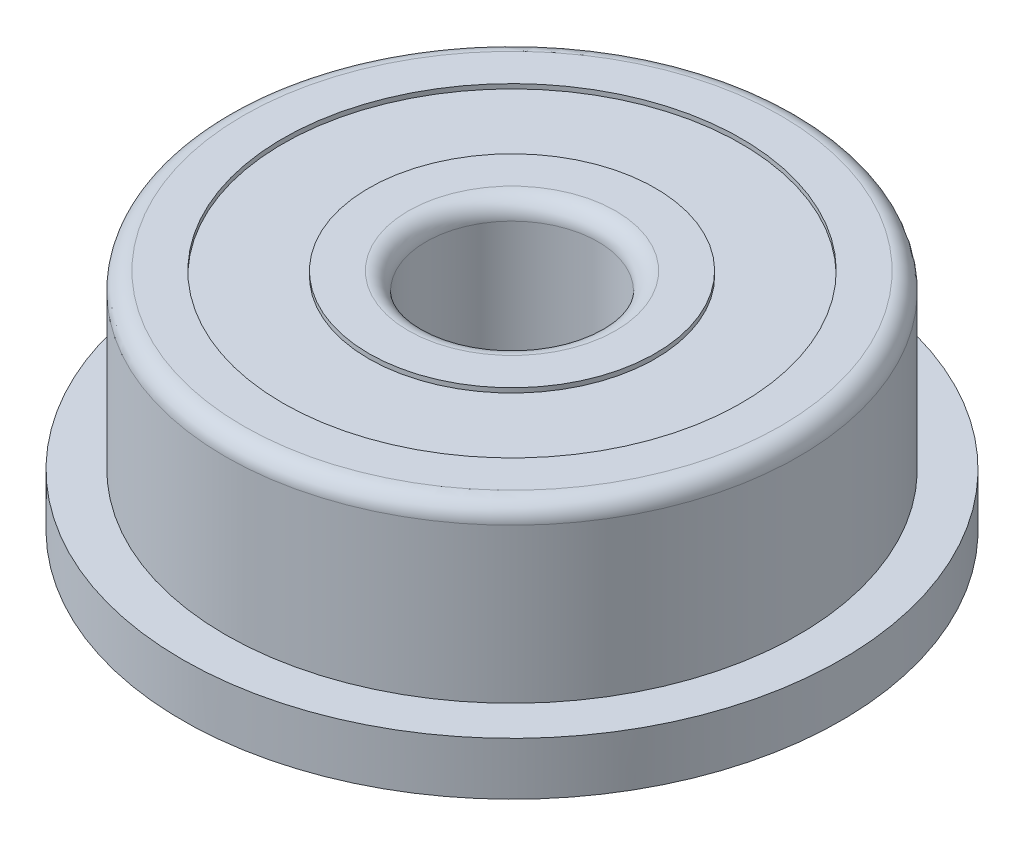
ISO-10303-21;
HEADER;
FILE_DESCRIPTION(('STEP AP214'),'2;1');
FILE_NAME('part.step','',(''),(''),'','','');
FILE_SCHEMA(('AUTOMOTIVE_DESIGN { 1 0 10303 214 1 1 1 1 }'));
ENDSEC;
DATA;
#1=APPLICATION_CONTEXT('core data for automotive mechanical design processes');
#2=APPLICATION_PROTOCOL_DEFINITION('international standard','automotive_design',2000,#1);
#3=PRODUCT_CONTEXT('',#1,'mechanical');
#4=PRODUCT('Part','Part','',(#3));
#5=PRODUCT_RELATED_PRODUCT_CATEGORY('part','',(#4));
#6=PRODUCT_DEFINITION_FORMATION('','',#4);
#7=PRODUCT_DEFINITION_CONTEXT('part definition',#1,'design');
#8=PRODUCT_DEFINITION('design','',#6,#7);
#9=PRODUCT_DEFINITION_SHAPE('','',#8);
#10=(LENGTH_UNIT() NAMED_UNIT(*) SI_UNIT(.MILLI.,.METRE.));
#11=(NAMED_UNIT(*) PLANE_ANGLE_UNIT() SI_UNIT($,.RADIAN.));
#12=(NAMED_UNIT(*) SI_UNIT($,.STERADIAN.) SOLID_ANGLE_UNIT());
#13=UNCERTAINTY_MEASURE_WITH_UNIT(LENGTH_MEASURE(1.E-05),#10,'distance_accuracy_value','');
#14=(GEOMETRIC_REPRESENTATION_CONTEXT(3) GLOBAL_UNCERTAINTY_ASSIGNED_CONTEXT((#13)) GLOBAL_UNIT_ASSIGNED_CONTEXT((#10,
#11,#12)) REPRESENTATION_CONTEXT('',''));
#15=CARTESIAN_POINT('',(0.,0.,0.));
#16=DIRECTION('',(0.,0.,1.));
#17=DIRECTION('',(1.,0.,0.));
#18=AXIS2_PLACEMENT_3D('',#15,#16,#17);
#19=CARTESIAN_POINT('',(0.,4.,0.));
#20=DIRECTION('',(0.,1.,0.));
#21=DIRECTION('',(0.,0.,1.));
#22=AXIS2_PLACEMENT_3D('',#19,#20,#21);
#23=PLANE('',#22);
#24=CARTESIAN_POINT('',(0.,4.,0.));
#25=DIRECTION('',(0.,1.,0.));
#26=DIRECTION('',(0.,0.,1.));
#27=AXIS2_PLACEMENT_3D('',#24,#25,#26);
#28=CIRCLE('',#27,1.81);
#29=CARTESIAN_POINT('',(0.,4.,1.81));
#30=VERTEX_POINT('',#29);
#31=EDGE_CURVE('E10',#30,#30,#28,.F.);
#32=ORIENTED_EDGE('',*,*,#31,.T.);
#33=EDGE_LOOP('',(#32));
#34=FACE_BOUND('',#33,.T.);
#35=CARTESIAN_POINT('',(0.,4.,0.));
#36=DIRECTION('',(0.,1.,0.));
#37=DIRECTION('',(0.,0.,1.));
#38=AXIS2_PLACEMENT_3D('',#35,#36,#37);
#39=CIRCLE('',#38,2.5);
#40=CARTESIAN_POINT('',(0.,4.,2.5));
#41=VERTEX_POINT('',#40);
#42=EDGE_CURVE('E81',#41,#41,#39,.T.);
#43=ORIENTED_EDGE('',*,*,#42,.T.);
#44=EDGE_LOOP('',(#43));
#45=FACE_BOUND('',#44,.T.);
#46=ADVANCED_FACE('F33',(#34,#45),#23,.T.);
#47=CARTESIAN_POINT('',(0.,1.,0.));
#48=DIRECTION('',(0.,-1.,0.));
#49=DIRECTION('',(0.,0.,-1.));
#50=AXIS2_PLACEMENT_3D('',#47,#48,#49);
#51=CYLINDRICAL_SURFACE('',#50,5.75);
#52=CARTESIAN_POINT('',(0.,1.,0.));
#53=DIRECTION('',(0.,1.,0.));
#54=DIRECTION('',(0.,0.,1.));
#55=AXIS2_PLACEMENT_3D('',#52,#53,#54);
#56=CIRCLE('',#55,5.75);
#57=CARTESIAN_POINT('',(0.,1.,5.75));
#58=VERTEX_POINT('',#57);
#59=EDGE_CURVE('E63',#58,#58,#56,.T.);
#60=ORIENTED_EDGE('',*,*,#59,.F.);
#61=EDGE_LOOP('',(#60));
#62=FACE_BOUND('',#61,.T.);
#63=CARTESIAN_POINT('',(0.,0.08,0.));
#64=DIRECTION('',(0.,-1.,0.));
#65=DIRECTION('',(0.,0.,-1.));
#66=AXIS2_PLACEMENT_3D('',#63,#64,#65);
#67=CIRCLE('',#66,5.75);
#68=CARTESIAN_POINT('',(0.,0.08,-5.75));
#69=VERTEX_POINT('',#68);
#70=EDGE_CURVE('E60',#69,#69,#67,.T.);
#71=ORIENTED_EDGE('',*,*,#70,.F.);
#72=EDGE_LOOP('',(#71));
#73=FACE_BOUND('',#72,.T.);
#74=ADVANCED_FACE('F119',(#62,#73),#51,.T.);
#75=CARTESIAN_POINT('',(0.,0.,0.));
#76=DIRECTION('',(0.,1.,0.));
#77=DIRECTION('',(0.,0.,1.));
#78=AXIS2_PLACEMENT_3D('',#75,#76,#77);
#79=PLANE('',#78);
#80=CARTESIAN_POINT('',(0.,0.,0.));
#81=DIRECTION('',(0.,1.,0.));
#82=DIRECTION('',(0.,0.,1.));
#83=AXIS2_PLACEMENT_3D('',#80,#81,#82);
#84=CIRCLE('',#83,1.81);
#85=CARTESIAN_POINT('',(0.,0.,1.81));
#86=VERTEX_POINT('',#85);
#87=EDGE_CURVE('E56',#86,#86,#84,.T.);
#88=ORIENTED_EDGE('',*,*,#87,.T.);
#89=EDGE_LOOP('',(#88));
#90=FACE_BOUND('',#89,.T.);
#91=CARTESIAN_POINT('',(0.,0.,0.));
#92=DIRECTION('',(0.,-1.,0.));
#93=DIRECTION('',(0.,0.,-1.));
#94=AXIS2_PLACEMENT_3D('',#91,#92,#93);
#95=CIRCLE('',#94,4.);
#96=CARTESIAN_POINT('',(0.,0.,-4.));
#97=VERTEX_POINT('',#96);
#98=EDGE_CURVE('E69',#97,#97,#95,.T.);
#99=ORIENTED_EDGE('',*,*,#98,.T.);
#100=EDGE_LOOP('',(#99));
#101=FACE_BOUND('',#100,.T.);
#102=ADVANCED_FACE('F123',(#90,#101),#79,.F.);
#103=CARTESIAN_POINT('',(0.,1.,0.));
#104=DIRECTION('',(0.,1.,0.));
#105=DIRECTION('',(0.,0.,1.));
#106=AXIS2_PLACEMENT_3D('',#103,#104,#105);
#107=PLANE('',#106);
#108=CARTESIAN_POINT('',(0.,1.,0.));
#109=DIRECTION('',(0.,1.,0.));
#110=DIRECTION('',(0.,0.,1.));
#111=AXIS2_PLACEMENT_3D('',#108,#109,#110);
#112=CIRCLE('',#111,5.);
#113=CARTESIAN_POINT('',(0.,1.,5.));
#114=VERTEX_POINT('',#113);
#115=EDGE_CURVE('E59',#114,#114,#112,.T.);
#116=ORIENTED_EDGE('',*,*,#115,.F.);
#117=EDGE_LOOP('',(#116));
#118=FACE_BOUND('',#117,.T.);
#119=ORIENTED_EDGE('',*,*,#59,.T.);
#120=EDGE_LOOP('',(#119));
#121=FACE_BOUND('',#120,.T.);
#122=ADVANCED_FACE('F116',(#118,#121),#107,.T.);
#123=CARTESIAN_POINT('',(0.,4.,0.));
#124=DIRECTION('',(0.,-1.,0.));
#125=DIRECTION('',(0.,0.,-1.));
#126=AXIS2_PLACEMENT_3D('',#123,#124,#125);
#127=CYLINDRICAL_SURFACE('',#126,5.);
#128=CARTESIAN_POINT('',(0.,3.69,0.));
#129=DIRECTION('',(0.,1.,0.));
#130=DIRECTION('',(0.,0.,1.));
#131=AXIS2_PLACEMENT_3D('',#128,#129,#130);
#132=CIRCLE('',#131,5.);
#133=CARTESIAN_POINT('',(0.,3.69,5.));
#134=VERTEX_POINT('',#133);
#135=EDGE_CURVE('E40',#134,#134,#132,.F.);
#136=ORIENTED_EDGE('',*,*,#135,.T.);
#137=EDGE_LOOP('',(#136));
#138=FACE_BOUND('',#137,.T.);
#139=ORIENTED_EDGE('',*,*,#115,.T.);
#140=EDGE_LOOP('',(#139));
#141=FACE_BOUND('',#140,.T.);
#142=ADVANCED_FACE('F106',(#138,#141),#127,.T.);
#143=CARTESIAN_POINT('',(0.,4.,0.));
#144=DIRECTION('',(0.,1.,0.));
#145=DIRECTION('',(0.,0.,1.));
#146=AXIS2_PLACEMENT_3D('',#143,#144,#145);
#147=CIRCLE('',#146,4.69);
#148=CARTESIAN_POINT('',(0.,4.,4.69));
#149=VERTEX_POINT('',#148);
#150=EDGE_CURVE('E44',#149,#149,#147,.T.);
#151=ORIENTED_EDGE('',*,*,#150,.T.);
#152=EDGE_LOOP('',(#151));
#153=FACE_BOUND('',#152,.T.);
#154=CARTESIAN_POINT('',(0.,4.,0.));
#155=DIRECTION('',(0.,1.,0.));
#156=DIRECTION('',(0.,0.,1.));
#157=AXIS2_PLACEMENT_3D('',#154,#155,#156);
#158=CIRCLE('',#157,4.);
#159=CARTESIAN_POINT('',(0.,4.,4.));
#160=VERTEX_POINT('',#159);
#161=EDGE_CURVE('E75',#160,#160,#158,.T.);
#162=ORIENTED_EDGE('',*,*,#161,.F.);
#163=EDGE_LOOP('',(#162));
#164=FACE_BOUND('',#163,.T.);
#165=ADVANCED_FACE('F103',(#153,#164),#23,.T.);
#166=CARTESIAN_POINT('',(0.,0.,0.));
#167=DIRECTION('',(0.,1.,0.));
#168=DIRECTION('',(0.,0.,1.));
#169=AXIS2_PLACEMENT_3D('',#166,#167,#168);
#170=CYLINDRICAL_SURFACE('',#169,1.5);
#171=CARTESIAN_POINT('',(0.,0.31,0.));
#172=DIRECTION('',(0.,1.,0.));
#173=DIRECTION('',(0.,0.,1.));
#174=AXIS2_PLACEMENT_3D('',#171,#172,#173);
#175=CIRCLE('',#174,1.5);
#176=CARTESIAN_POINT('',(0.,0.31,1.5));
#177=VERTEX_POINT('',#176);
#178=EDGE_CURVE('E48',#177,#177,#175,.F.);
#179=ORIENTED_EDGE('',*,*,#178,.T.);
#180=EDGE_LOOP('',(#179));
#181=FACE_BOUND('',#180,.T.);
#182=CARTESIAN_POINT('',(0.,3.69,0.));
#183=DIRECTION('',(0.,1.,0.));
#184=DIRECTION('',(0.,0.,1.));
#185=AXIS2_PLACEMENT_3D('',#182,#183,#184);
#186=CIRCLE('',#185,1.5);
#187=CARTESIAN_POINT('',(0.,3.69,1.5));
#188=VERTEX_POINT('',#187);
#189=EDGE_CURVE('E53',#188,#188,#186,.T.);
#190=ORIENTED_EDGE('',*,*,#189,.T.);
#191=EDGE_LOOP('',(#190));
#192=FACE_BOUND('',#191,.T.);
#193=ADVANCED_FACE('F105',(#181,#192),#170,.F.);
#194=CARTESIAN_POINT('',(0.,0.08,0.));
#195=DIRECTION('',(0.,-1.,0.));
#196=DIRECTION('',(0.,0.,-1.));
#197=AXIS2_PLACEMENT_3D('',#194,#195,#196);
#198=PLANE('',#197);
#199=CARTESIAN_POINT('',(0.,0.08,0.));
#200=DIRECTION('',(0.,-1.,0.));
#201=DIRECTION('',(0.,0.,-1.));
#202=AXIS2_PLACEMENT_3D('',#199,#200,#201);
#203=CIRCLE('',#202,4.);
#204=CARTESIAN_POINT('',(0.,0.08,-4.));
#205=VERTEX_POINT('',#204);
#206=EDGE_CURVE('E64',#205,#205,#203,.T.);
#207=ORIENTED_EDGE('',*,*,#206,.F.);
#208=EDGE_LOOP('',(#207));
#209=FACE_BOUND('',#208,.T.);
#210=ORIENTED_EDGE('',*,*,#70,.T.);
#211=EDGE_LOOP('',(#210));
#212=FACE_BOUND('',#211,.T.);
#213=ADVANCED_FACE('F113',(#209,#212),#198,.T.);
#214=CARTESIAN_POINT('',(0.,0.08,0.));
#215=DIRECTION('',(0.,-1.,0.));
#216=DIRECTION('',(0.,0.,-1.));
#217=AXIS2_PLACEMENT_3D('',#214,#215,#216);
#218=CYLINDRICAL_SURFACE('',#217,4.);
#219=CARTESIAN_POINT('',(0.,0.08,-4.));
#220=CARTESIAN_POINT('',(0.,0.0791666666666667,-4.));
#221=CARTESIAN_POINT('',(0.,0.0783333333333333,-4.));
#222=CARTESIAN_POINT('',(0.,0.0766666666666667,-4.));
#223=CARTESIAN_POINT('',(0.,0.0758333333333333,-4.));
#224=CARTESIAN_POINT('',(0.,0.0741666666666667,-4.));
#225=CARTESIAN_POINT('',(0.,0.0733333333333333,-4.));
#226=CARTESIAN_POINT('',(0.,0.0716666666666667,-4.));
#227=CARTESIAN_POINT('',(0.,0.0708333333333333,-4.));
#228=CARTESIAN_POINT('',(0.,0.0691666666666667,-4.));
#229=CARTESIAN_POINT('',(0.,0.0683333333333333,-4.));
#230=CARTESIAN_POINT('',(0.,0.0666666666666667,-4.));
#231=CARTESIAN_POINT('',(0.,0.0658333333333333,-4.));
#232=CARTESIAN_POINT('',(0.,0.0641666666666667,-4.));
#233=CARTESIAN_POINT('',(0.,0.0633333333333333,-4.));
#234=CARTESIAN_POINT('',(0.,0.0616666666666667,-4.));
#235=CARTESIAN_POINT('',(0.,0.0608333333333333,-4.));
#236=CARTESIAN_POINT('',(0.,0.0591666666666667,-4.));
#237=CARTESIAN_POINT('',(0.,0.0583333333333333,-4.));
#238=CARTESIAN_POINT('',(0.,0.0566666666666667,-4.));
#239=CARTESIAN_POINT('',(0.,0.0558333333333333,-4.));
#240=CARTESIAN_POINT('',(0.,0.0541666666666667,-4.));
#241=CARTESIAN_POINT('',(0.,0.0533333333333333,-4.));
#242=CARTESIAN_POINT('',(0.,0.0516666666666667,-4.));
#243=CARTESIAN_POINT('',(0.,0.0508333333333333,-4.));
#244=CARTESIAN_POINT('',(0.,0.0491666666666667,-4.));
#245=CARTESIAN_POINT('',(0.,0.0483333333333333,-4.));
#246=CARTESIAN_POINT('',(0.,0.0466666666666667,-4.));
#247=CARTESIAN_POINT('',(0.,0.0458333333333333,-4.));
#248=CARTESIAN_POINT('',(0.,0.0441666666666667,-4.));
#249=CARTESIAN_POINT('',(0.,0.0433333333333333,-4.));
#250=CARTESIAN_POINT('',(0.,0.0416666666666667,-4.));
#251=CARTESIAN_POINT('',(0.,0.0408333333333333,-4.));
#252=CARTESIAN_POINT('',(0.,0.0391666666666667,-4.));
#253=CARTESIAN_POINT('',(0.,0.0383333333333333,-4.));
#254=CARTESIAN_POINT('',(0.,0.0366666666666667,-4.));
#255=CARTESIAN_POINT('',(0.,0.0358333333333333,-4.));
#256=CARTESIAN_POINT('',(0.,0.0341666666666667,-4.));
#257=CARTESIAN_POINT('',(0.,0.0333333333333333,-4.));
#258=CARTESIAN_POINT('',(0.,0.0316666666666667,-4.));
#259=CARTESIAN_POINT('',(0.,0.0308333333333333,-4.));
#260=CARTESIAN_POINT('',(0.,0.0291666666666667,-4.));
#261=CARTESIAN_POINT('',(0.,0.0283333333333333,-4.));
#262=CARTESIAN_POINT('',(0.,0.0266666666666667,-4.));
#263=CARTESIAN_POINT('',(0.,0.0258333333333333,-4.));
#264=CARTESIAN_POINT('',(0.,0.0241666666666667,-4.));
#265=CARTESIAN_POINT('',(0.,0.0233333333333333,-4.));
#266=CARTESIAN_POINT('',(0.,0.0216666666666667,-4.));
#267=CARTESIAN_POINT('',(0.,0.0208333333333333,-4.));
#268=CARTESIAN_POINT('',(0.,0.0191666666666667,-4.));
#269=CARTESIAN_POINT('',(0.,0.0183333333333333,-4.));
#270=CARTESIAN_POINT('',(0.,0.0166666666666667,-4.));
#271=CARTESIAN_POINT('',(0.,0.0158333333333333,-4.));
#272=CARTESIAN_POINT('',(0.,0.0141666666666667,-4.));
#273=CARTESIAN_POINT('',(0.,0.0133333333333333,-4.));
#274=CARTESIAN_POINT('',(0.,0.0116666666666667,-4.));
#275=CARTESIAN_POINT('',(0.,0.0108333333333333,-4.));
#276=CARTESIAN_POINT('',(0.,0.00916666666666667,-4.));
#277=CARTESIAN_POINT('',(0.,0.00833333333333334,-4.));
#278=CARTESIAN_POINT('',(0.,0.00666666666666667,-4.));
#279=CARTESIAN_POINT('',(0.,0.00583333333333333,-4.));
#280=CARTESIAN_POINT('',(0.,0.00416666666666667,-4.));
#281=CARTESIAN_POINT('',(0.,0.00333333333333334,-4.));
#282=CARTESIAN_POINT('',(0.,0.00166666666666667,-4.));
#283=CARTESIAN_POINT('',(0.,0.000833333333333335,-4.));
#284=CARTESIAN_POINT('',(0.,0.,-4.));
#285=B_SPLINE_CURVE_WITH_KNOTS('',3,(#219,#220,#221,#222,#223,#224,#225,#226,#227,#228,#229,
#230,#231,#232,#233,#234,#235,#236,#237,#238,#239,#240,#241,#242,#243,#244,#245,#246,#247,#248,
#249,#250,#251,#252,#253,#254,#255,#256,#257,#258,#259,#260,#261,#262,#263,#264,#265,#266,#267,
#268,#269,#270,#271,#272,#273,#274,#275,#276,#277,#278,#279,#280,#281,#282,#283,#284),
.UNSPECIFIED.,.F.,.F.,(4,2,2,2,2,2,2,2,2,2,2,2,2,2,2,2,2,2,2,2,2,2,2,2,2,2,2,2,2,2,2,2,4),(0.,
0.00250000000000001,0.00500000000000001,0.00750000000000001,0.01,0.0125,0.015,0.0175,0.02,
0.0225,0.025,0.0275,0.03,0.0325,0.035,0.0375,0.04,0.0425,0.045,0.0475,0.05,0.0525,0.055,0.0575,
0.06,0.0625,0.065,0.0675,0.07,0.0725,0.075,0.0775,0.08),.UNSPECIFIED.);
#286=EDGE_CURVE('BSEAM99',#205,#97,#285,.T.);
#287=ORIENTED_EDGE('',*,*,#206,.T.);
#288=ORIENTED_EDGE('',*,*,#98,.F.);
#289=ORIENTED_EDGE('',*,*,#286,.T.);
#290=ORIENTED_EDGE('',*,*,#286,.F.);
#291=EDGE_LOOP('',(#287,#289,#288,#290));
#292=FACE_BOUND('',#291,.T.);
#293=ADVANCED_FACE('F99',(#292),#218,.T.);
#294=CARTESIAN_POINT('',(0.,3.92,0.));
#295=DIRECTION('',(0.,1.,0.));
#296=DIRECTION('',(0.,0.,1.));
#297=AXIS2_PLACEMENT_3D('',#294,#295,#296);
#298=CYLINDRICAL_SURFACE('',#297,4.);
#299=CARTESIAN_POINT('',(0.,3.92,0.));
#300=DIRECTION('',(0.,1.,0.));
#301=DIRECTION('',(0.,0.,1.));
#302=AXIS2_PLACEMENT_3D('',#299,#300,#301);
#303=CIRCLE('',#302,4.);
#304=CARTESIAN_POINT('',(0.,3.92,4.));
#305=VERTEX_POINT('',#304);
#306=EDGE_CURVE('E72',#305,#305,#303,.T.);
#307=CARTESIAN_POINT('',(0.,3.92,4.));
#308=CARTESIAN_POINT('',(0.,3.92083333333333,4.));
#309=CARTESIAN_POINT('',(0.,3.92166666666667,4.));
#310=CARTESIAN_POINT('',(0.,3.92333333333333,4.));
#311=CARTESIAN_POINT('',(0.,3.92416666666667,4.));
#312=CARTESIAN_POINT('',(0.,3.92583333333333,4.));
#313=CARTESIAN_POINT('',(0.,3.92666666666667,4.));
#314=CARTESIAN_POINT('',(0.,3.92833333333333,4.));
#315=CARTESIAN_POINT('',(0.,3.92916666666667,4.));
#316=CARTESIAN_POINT('',(0.,3.93083333333333,4.));
#317=CARTESIAN_POINT('',(0.,3.93166666666667,4.));
#318=CARTESIAN_POINT('',(0.,3.93333333333333,4.));
#319=CARTESIAN_POINT('',(0.,3.93416666666667,4.));
#320=CARTESIAN_POINT('',(0.,3.93583333333333,4.));
#321=CARTESIAN_POINT('',(0.,3.93666666666667,4.));
#322=CARTESIAN_POINT('',(0.,3.93833333333333,4.));
#323=CARTESIAN_POINT('',(0.,3.93916666666667,4.));
#324=CARTESIAN_POINT('',(0.,3.94083333333333,4.));
#325=CARTESIAN_POINT('',(0.,3.94166666666667,4.));
#326=CARTESIAN_POINT('',(0.,3.94333333333333,4.));
#327=CARTESIAN_POINT('',(0.,3.94416666666667,4.));
#328=CARTESIAN_POINT('',(0.,3.94583333333333,4.));
#329=CARTESIAN_POINT('',(0.,3.94666666666667,4.));
#330=CARTESIAN_POINT('',(0.,3.94833333333333,4.));
#331=CARTESIAN_POINT('',(0.,3.94916666666667,4.));
#332=CARTESIAN_POINT('',(0.,3.95083333333333,4.));
#333=CARTESIAN_POINT('',(0.,3.95166666666667,4.));
#334=CARTESIAN_POINT('',(0.,3.95333333333333,4.));
#335=CARTESIAN_POINT('',(0.,3.95416666666667,4.));
#336=CARTESIAN_POINT('',(0.,3.95583333333333,4.));
#337=CARTESIAN_POINT('',(0.,3.95666666666667,4.));
#338=CARTESIAN_POINT('',(0.,3.95833333333333,4.));
#339=CARTESIAN_POINT('',(0.,3.95916666666667,4.));
#340=CARTESIAN_POINT('',(0.,3.96083333333333,4.));
#341=CARTESIAN_POINT('',(0.,3.96166666666667,4.));
#342=CARTESIAN_POINT('',(0.,3.96333333333333,4.));
#343=CARTESIAN_POINT('',(0.,3.96416666666667,4.));
#344=CARTESIAN_POINT('',(0.,3.96583333333333,4.));
#345=CARTESIAN_POINT('',(0.,3.96666666666667,4.));
#346=CARTESIAN_POINT('',(0.,3.96833333333333,4.));
#347=CARTESIAN_POINT('',(0.,3.96916666666667,4.));
#348=CARTESIAN_POINT('',(0.,3.97083333333333,4.));
#349=CARTESIAN_POINT('',(0.,3.97166666666667,4.));
#350=CARTESIAN_POINT('',(0.,3.97333333333333,4.));
#351=CARTESIAN_POINT('',(0.,3.97416666666667,4.));
#352=CARTESIAN_POINT('',(0.,3.97583333333333,4.));
#353=CARTESIAN_POINT('',(0.,3.97666666666667,4.));
#354=CARTESIAN_POINT('',(0.,3.97833333333333,4.));
#355=CARTESIAN_POINT('',(0.,3.97916666666667,4.));
#356=CARTESIAN_POINT('',(0.,3.98083333333333,4.));
#357=CARTESIAN_POINT('',(0.,3.98166666666667,4.));
#358=CARTESIAN_POINT('',(0.,3.98333333333333,4.));
#359=CARTESIAN_POINT('',(0.,3.98416666666667,4.));
#360=CARTESIAN_POINT('',(0.,3.98583333333333,4.));
#361=CARTESIAN_POINT('',(0.,3.98666666666667,4.));
#362=CARTESIAN_POINT('',(0.,3.98833333333333,4.));
#363=CARTESIAN_POINT('',(0.,3.98916666666667,4.));
#364=CARTESIAN_POINT('',(0.,3.99083333333333,4.));
#365=CARTESIAN_POINT('',(0.,3.99166666666667,4.));
#366=CARTESIAN_POINT('',(0.,3.99333333333333,4.));
#367=CARTESIAN_POINT('',(0.,3.99416666666667,4.));
#368=CARTESIAN_POINT('',(0.,3.99583333333333,4.));
#369=CARTESIAN_POINT('',(0.,3.99666666666667,4.));
#370=CARTESIAN_POINT('',(0.,3.99833333333333,4.));
#371=CARTESIAN_POINT('',(0.,3.99916666666667,4.));
#372=CARTESIAN_POINT('',(0.,4.,4.));
#373=B_SPLINE_CURVE_WITH_KNOTS('',3,(#307,#308,#309,#310,#311,#312,#313,#314,#315,#316,#317,
#318,#319,#320,#321,#322,#323,#324,#325,#326,#327,#328,#329,#330,#331,#332,#333,#334,#335,#336,
#337,#338,#339,#340,#341,#342,#343,#344,#345,#346,#347,#348,#349,#350,#351,#352,#353,#354,#355,
#356,#357,#358,#359,#360,#361,#362,#363,#364,#365,#366,#367,#368,#369,#370,#371,#372),
.UNSPECIFIED.,.F.,.F.,(4,2,2,2,2,2,2,2,2,2,2,2,2,2,2,2,2,2,2,2,2,2,2,2,2,2,2,2,2,2,2,2,4),(0.,
0.0024999999999999,0.0049999999999998,0.00749999999999969,0.00999999999999959,
0.0124999999999995,0.0149999999999994,0.0174999999999993,0.0199999999999992,0.0225,
0.0249999999999998,0.0274999999999997,0.0299999999999996,0.0324999999999995,0.0349999999999994,
0.0374999999999993,0.0399999999999992,0.0425,0.0449999999999999,0.0474999999999998,
0.0499999999999997,0.0524999999999996,0.0549999999999995,0.0574999999999994,0.0599999999999993,
0.0625000000000001,0.0649999999999999,0.0674999999999999,0.0699999999999998,0.0724999999999996,
0.0749999999999995,0.0774999999999994,0.0799999999999993),.UNSPECIFIED.);
#374=EDGE_CURVE('BSEAM93',#305,#160,#373,.T.);
#375=ORIENTED_EDGE('',*,*,#306,.F.);
#376=ORIENTED_EDGE('',*,*,#161,.T.);
#377=ORIENTED_EDGE('',*,*,#374,.T.);
#378=ORIENTED_EDGE('',*,*,#374,.F.);
#379=EDGE_LOOP('',(#375,#377,#376,#378));
#380=FACE_BOUND('',#379,.T.);
#381=ADVANCED_FACE('F93',(#380),#298,.F.);
#382=CARTESIAN_POINT('',(0.,3.92,0.));
#383=DIRECTION('',(0.,1.,0.));
#384=DIRECTION('',(0.,0.,1.));
#385=AXIS2_PLACEMENT_3D('',#382,#383,#384);
#386=PLANE('',#385);
#387=CARTESIAN_POINT('',(0.,3.92,0.));
#388=DIRECTION('',(0.,1.,0.));
#389=DIRECTION('',(0.,0.,1.));
#390=AXIS2_PLACEMENT_3D('',#387,#388,#389);
#391=CIRCLE('',#390,2.5);
#392=CARTESIAN_POINT('',(0.,3.92,2.5));
#393=VERTEX_POINT('',#392);
#394=EDGE_CURVE('E78',#393,#393,#391,.T.);
#395=ORIENTED_EDGE('',*,*,#394,.F.);
#396=EDGE_LOOP('',(#395));
#397=FACE_BOUND('',#396,.T.);
#398=ORIENTED_EDGE('',*,*,#306,.T.);
#399=EDGE_LOOP('',(#398));
#400=FACE_BOUND('',#399,.T.);
#401=ADVANCED_FACE('F90',(#397,#400),#386,.T.);
#402=CARTESIAN_POINT('',(0.,3.92,0.));
#403=DIRECTION('',(0.,1.,0.));
#404=DIRECTION('',(0.,0.,1.));
#405=AXIS2_PLACEMENT_3D('',#402,#403,#404);
#406=CYLINDRICAL_SURFACE('',#405,2.5);
#407=CARTESIAN_POINT('',(0.,3.92,2.5));
#408=CARTESIAN_POINT('',(0.,3.92083333333333,2.5));
#409=CARTESIAN_POINT('',(0.,3.92166666666667,2.5));
#410=CARTESIAN_POINT('',(0.,3.92333333333333,2.5));
#411=CARTESIAN_POINT('',(0.,3.92416666666667,2.5));
#412=CARTESIAN_POINT('',(0.,3.92583333333333,2.5));
#413=CARTESIAN_POINT('',(0.,3.92666666666667,2.5));
#414=CARTESIAN_POINT('',(0.,3.92833333333333,2.5));
#415=CARTESIAN_POINT('',(0.,3.92916666666667,2.5));
#416=CARTESIAN_POINT('',(0.,3.93083333333333,2.5));
#417=CARTESIAN_POINT('',(0.,3.93166666666667,2.5));
#418=CARTESIAN_POINT('',(0.,3.93333333333333,2.5));
#419=CARTESIAN_POINT('',(0.,3.93416666666667,2.5));
#420=CARTESIAN_POINT('',(0.,3.93583333333333,2.5));
#421=CARTESIAN_POINT('',(0.,3.93666666666667,2.5));
#422=CARTESIAN_POINT('',(0.,3.93833333333333,2.5));
#423=CARTESIAN_POINT('',(0.,3.93916666666667,2.5));
#424=CARTESIAN_POINT('',(0.,3.94083333333333,2.5));
#425=CARTESIAN_POINT('',(0.,3.94166666666667,2.5));
#426=CARTESIAN_POINT('',(0.,3.94333333333333,2.5));
#427=CARTESIAN_POINT('',(0.,3.94416666666667,2.5));
#428=CARTESIAN_POINT('',(0.,3.94583333333333,2.5));
#429=CARTESIAN_POINT('',(0.,3.94666666666667,2.5));
#430=CARTESIAN_POINT('',(0.,3.94833333333333,2.5));
#431=CARTESIAN_POINT('',(0.,3.94916666666667,2.5));
#432=CARTESIAN_POINT('',(0.,3.95083333333333,2.5));
#433=CARTESIAN_POINT('',(0.,3.95166666666667,2.5));
#434=CARTESIAN_POINT('',(0.,3.95333333333333,2.5));
#435=CARTESIAN_POINT('',(0.,3.95416666666667,2.5));
#436=CARTESIAN_POINT('',(0.,3.95583333333333,2.5));
#437=CARTESIAN_POINT('',(0.,3.95666666666667,2.5));
#438=CARTESIAN_POINT('',(0.,3.95833333333333,2.5));
#439=CARTESIAN_POINT('',(0.,3.95916666666667,2.5));
#440=CARTESIAN_POINT('',(0.,3.96083333333333,2.5));
#441=CARTESIAN_POINT('',(0.,3.96166666666667,2.5));
#442=CARTESIAN_POINT('',(0.,3.96333333333333,2.5));
#443=CARTESIAN_POINT('',(0.,3.96416666666667,2.5));
#444=CARTESIAN_POINT('',(0.,3.96583333333333,2.5));
#445=CARTESIAN_POINT('',(0.,3.96666666666667,2.5));
#446=CARTESIAN_POINT('',(0.,3.96833333333333,2.5));
#447=CARTESIAN_POINT('',(0.,3.96916666666667,2.5));
#448=CARTESIAN_POINT('',(0.,3.97083333333333,2.5));
#449=CARTESIAN_POINT('',(0.,3.97166666666667,2.5));
#450=CARTESIAN_POINT('',(0.,3.97333333333333,2.5));
#451=CARTESIAN_POINT('',(0.,3.97416666666667,2.5));
#452=CARTESIAN_POINT('',(0.,3.97583333333333,2.5));
#453=CARTESIAN_POINT('',(0.,3.97666666666667,2.5));
#454=CARTESIAN_POINT('',(0.,3.97833333333333,2.5));
#455=CARTESIAN_POINT('',(0.,3.97916666666667,2.5));
#456=CARTESIAN_POINT('',(0.,3.98083333333333,2.5));
#457=CARTESIAN_POINT('',(0.,3.98166666666667,2.5));
#458=CARTESIAN_POINT('',(0.,3.98333333333333,2.5));
#459=CARTESIAN_POINT('',(0.,3.98416666666667,2.5));
#460=CARTESIAN_POINT('',(0.,3.98583333333333,2.5));
#461=CARTESIAN_POINT('',(0.,3.98666666666667,2.5));
#462=CARTESIAN_POINT('',(0.,3.98833333333333,2.5));
#463=CARTESIAN_POINT('',(0.,3.98916666666667,2.5));
#464=CARTESIAN_POINT('',(0.,3.99083333333333,2.5));
#465=CARTESIAN_POINT('',(0.,3.99166666666667,2.5));
#466=CARTESIAN_POINT('',(0.,3.99333333333333,2.5));
#467=CARTESIAN_POINT('',(0.,3.99416666666667,2.5));
#468=CARTESIAN_POINT('',(0.,3.99583333333333,2.5));
#469=CARTESIAN_POINT('',(0.,3.99666666666667,2.5));
#470=CARTESIAN_POINT('',(0.,3.99833333333333,2.5));
#471=CARTESIAN_POINT('',(0.,3.99916666666667,2.5));
#472=CARTESIAN_POINT('',(0.,4.,2.5));
#473=B_SPLINE_CURVE_WITH_KNOTS('',3,(#407,#408,#409,#410,#411,#412,#413,#414,#415,#416,#417,
#418,#419,#420,#421,#422,#423,#424,#425,#426,#427,#428,#429,#430,#431,#432,#433,#434,#435,#436,
#437,#438,#439,#440,#441,#442,#443,#444,#445,#446,#447,#448,#449,#450,#451,#452,#453,#454,#455,
#456,#457,#458,#459,#460,#461,#462,#463,#464,#465,#466,#467,#468,#469,#470,#471,#472),
.UNSPECIFIED.,.F.,.F.,(4,2,2,2,2,2,2,2,2,2,2,2,2,2,2,2,2,2,2,2,2,2,2,2,2,2,2,2,2,2,2,2,4),(0.,
0.0024999999999999,0.0049999999999998,0.00749999999999969,0.00999999999999959,
0.0124999999999995,0.0149999999999994,0.0174999999999993,0.0199999999999992,0.0225,
0.0249999999999998,0.0274999999999997,0.0299999999999996,0.0324999999999995,0.0349999999999994,
0.0374999999999993,0.0399999999999992,0.0425,0.0449999999999999,0.0474999999999998,
0.0499999999999997,0.0524999999999996,0.0549999999999995,0.0574999999999994,0.0599999999999993,
0.0625000000000001,0.0649999999999999,0.0674999999999999,0.0699999999999998,0.0724999999999996,
0.0749999999999995,0.0774999999999994,0.0799999999999993),.UNSPECIFIED.);
#474=EDGE_CURVE('BSEAM87',#393,#41,#473,.T.);
#475=ORIENTED_EDGE('',*,*,#394,.T.);
#476=ORIENTED_EDGE('',*,*,#42,.F.);
#477=ORIENTED_EDGE('',*,*,#474,.T.);
#478=ORIENTED_EDGE('',*,*,#474,.F.);
#479=EDGE_LOOP('',(#475,#477,#476,#478));
#480=FACE_BOUND('',#479,.T.);
#481=ADVANCED_FACE('F87',(#480),#406,.T.);
#482=CARTESIAN_POINT('',(0.,0.31,0.));
#483=DIRECTION('',(0.,1.,0.));
#484=DIRECTION('',(0.,0.,1.));
#485=AXIS2_PLACEMENT_3D('',#482,#483,#484);
#486=TOROIDAL_SURFACE('',#485,1.81,0.31);
#487=ORIENTED_EDGE('',*,*,#178,.F.);
#488=EDGE_LOOP('',(#487));
#489=FACE_BOUND('',#488,.T.);
#490=ORIENTED_EDGE('',*,*,#87,.F.);
#491=EDGE_LOOP('',(#490));
#492=FACE_BOUND('',#491,.T.);
#493=ADVANCED_FACE('F129',(#489,#492),#486,.T.);
#494=CARTESIAN_POINT('',(0.,3.69,0.));
#495=DIRECTION('',(0.,1.,0.));
#496=DIRECTION('',(0.,0.,1.));
#497=AXIS2_PLACEMENT_3D('',#494,#495,#496);
#498=TOROIDAL_SURFACE('',#497,4.69,0.31);
#499=ORIENTED_EDGE('',*,*,#135,.F.);
#500=EDGE_LOOP('',(#499));
#501=FACE_BOUND('',#500,.T.);
#502=ORIENTED_EDGE('',*,*,#150,.F.);
#503=EDGE_LOOP('',(#502));
#504=FACE_BOUND('',#503,.T.);
#505=ADVANCED_FACE('F134',(#501,#504),#498,.T.);
#506=CARTESIAN_POINT('',(0.,3.69,0.));
#507=DIRECTION('',(0.,1.,0.));
#508=DIRECTION('',(0.,0.,1.));
#509=AXIS2_PLACEMENT_3D('',#506,#507,#508);
#510=TOROIDAL_SURFACE('',#509,1.81,0.31);
#511=ORIENTED_EDGE('',*,*,#31,.F.);
#512=EDGE_LOOP('',(#511));
#513=FACE_BOUND('',#512,.T.);
#514=ORIENTED_EDGE('',*,*,#189,.F.);
#515=EDGE_LOOP('',(#514));
#516=FACE_BOUND('',#515,.T.);
#517=ADVANCED_FACE('F35',(#513,#516),#510,.T.);
#518=CLOSED_SHELL('',(#46,#74,#102,#122,#142,#165,#193,#213,#293,#381,#401,#481,#493,#505,#517));
#519=MANIFOLD_SOLID_BREP('B2',#518);
#520=ADVANCED_BREP_SHAPE_REPRESENTATION('',(#18,#519),#14);
#521=SHAPE_DEFINITION_REPRESENTATION(#9,#520);
ENDSEC;
END-ISO-10303-21;
